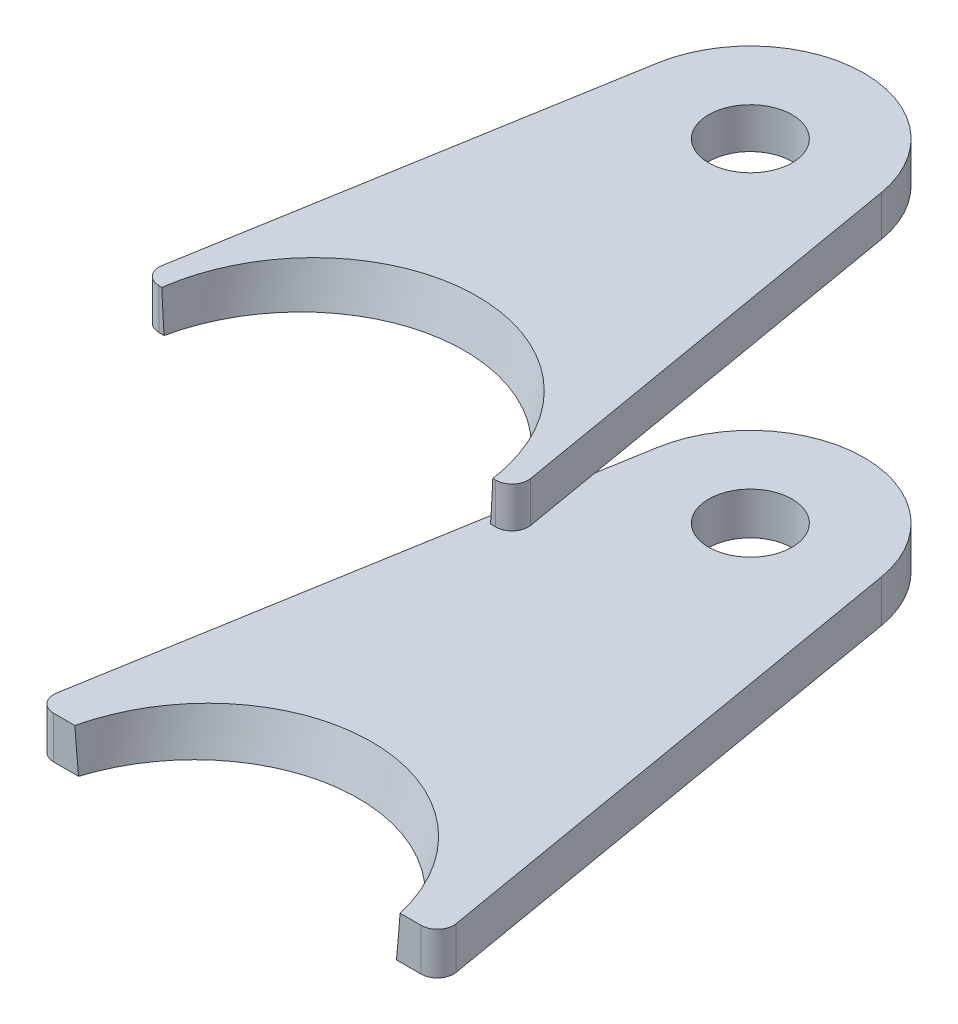
ISO-10303-21;
HEADER;
FILE_DESCRIPTION(('STEP AP214'),'2;1');
FILE_NAME('part.step','',(''),(''),'','','');
FILE_SCHEMA(('AUTOMOTIVE_DESIGN { 1 0 10303 214 1 1 1 1 }'));
ENDSEC;
DATA;
#1=APPLICATION_CONTEXT('core data for automotive mechanical design processes');
#2=APPLICATION_PROTOCOL_DEFINITION('international standard','automotive_design',2000,#1);
#3=PRODUCT_CONTEXT('',#1,'mechanical');
#4=PRODUCT('Part','Part','',(#3));
#5=PRODUCT_RELATED_PRODUCT_CATEGORY('part','',(#4));
#6=PRODUCT_DEFINITION_FORMATION('','',#4);
#7=PRODUCT_DEFINITION_CONTEXT('part definition',#1,'design');
#8=PRODUCT_DEFINITION('design','',#6,#7);
#9=PRODUCT_DEFINITION_SHAPE('','',#8);
#10=(LENGTH_UNIT() NAMED_UNIT(*) SI_UNIT(.MILLI.,.METRE.));
#11=(NAMED_UNIT(*) PLANE_ANGLE_UNIT() SI_UNIT($,.RADIAN.));
#12=(NAMED_UNIT(*) SI_UNIT($,.STERADIAN.) SOLID_ANGLE_UNIT());
#13=UNCERTAINTY_MEASURE_WITH_UNIT(LENGTH_MEASURE(1.E-05),#10,'distance_accuracy_value','');
#14=(GEOMETRIC_REPRESENTATION_CONTEXT(3) GLOBAL_UNCERTAINTY_ASSIGNED_CONTEXT((#13)) GLOBAL_UNIT_ASSIGNED_CONTEXT((#10,
#11,#12)) REPRESENTATION_CONTEXT('',''));
#15=CARTESIAN_POINT('',(0.,0.,0.));
#16=DIRECTION('',(0.,0.,1.));
#17=DIRECTION('',(1.,0.,0.));
#18=AXIS2_PLACEMENT_3D('',#15,#16,#17);
#19=CARTESIAN_POINT('',(0.,-11.43,0.));
#20=DIRECTION('',(0.,1.,0.));
#21=DIRECTION('',(0.,0.,-1.));
#22=AXIS2_PLACEMENT_3D('',#19,#20,#21);
#23=PLANE('',#22);
#24=DIRECTION('',(-1.,0.,0.));
#25=VECTOR('',#24,1.);
#26=CARTESIAN_POINT('',(0.,-11.43,40.1184711091296));
#27=LINE('',#26,#25);
#28=CARTESIAN_POINT('',(-12.7085522232766,-11.43,40.1184711091296));
#29=VERTEX_POINT('',#28);
#30=CARTESIAN_POINT('',(-14.3695490254812,-11.43,40.1184711091296));
#31=VERTEX_POINT('',#30);
#32=EDGE_CURVE('E128',#29,#31,#27,.T.);
#33=ORIENTED_EDGE('',*,*,#32,.F.);
#34=CARTESIAN_POINT('',(0.00635000098012531,-11.43,43.3453711793951));
#35=DIRECTION('',(0.,-1.,0.));
#36=DIRECTION('',(0.00174746557868569,0.,0.99999847318086));
#37=AXIS2_PLACEMENT_3D('',#34,#35,#36);
#38=ELLIPSE('',#37,13.7261621988406,13.081);
#39=CARTESIAN_POINT('',(12.7202169755613,-11.43,40.1184711091295));
#40=VERTEX_POINT('',#39);
#41=EDGE_CURVE('E135',#40,#29,#38,.F.);
#42=ORIENTED_EDGE('',*,*,#41,.F.);
#43=CARTESIAN_POINT('',(14.3695490254812,-11.43,40.1184711091295));
#44=VERTEX_POINT('',#43);
#45=EDGE_CURVE('E140',#44,#40,#27,.T.);
#46=ORIENTED_EDGE('',*,*,#45,.F.);
#47=CARTESIAN_POINT('',(14.3695490254812,-11.43,38.8484711091295));
#48=DIRECTION('',(0.,-1.,0.));
#49=DIRECTION('',(0.,0.,-1.));
#50=AXIS2_PLACEMENT_3D('',#47,#48,#49);
#51=CIRCLE('',#50,1.27);
#52=CARTESIAN_POINT('',(15.6214000011449,-11.43,38.6345338876608));
#53=VERTEX_POINT('',#52);
#54=EDGE_CURVE('E186',#53,#44,#51,.T.);
#55=ORIENTED_EDGE('',*,*,#54,.F.);
#56=DIRECTION('',(0.168454505093508,0.,0.985709429656479));
#57=VECTOR('',#56,1.);
#58=CARTESIAN_POINT('',(8.76295682964609,-11.43,-1.49756055028128));
#59=LINE('',#58,#57);
#60=CARTESIAN_POINT('',(8.76295682964609,-11.43,-1.49756055028128));
#61=VERTEX_POINT('',#60);
#62=EDGE_CURVE('E150',#61,#53,#59,.T.);
#63=ORIENTED_EDGE('',*,*,#62,.F.);
#64=CARTESIAN_POINT('',(0.,-11.43,0.));
#65=DIRECTION('',(0.,-1.,0.));
#66=DIRECTION('',(0.,0.,-1.));
#67=AXIS2_PLACEMENT_3D('',#64,#65,#66);
#68=CIRCLE('',#67,8.89);
#69=CARTESIAN_POINT('',(-8.76295682964609,-11.43,-1.49756055028128));
#70=VERTEX_POINT('',#69);
#71=EDGE_CURVE('E147',#70,#61,#68,.T.);
#72=ORIENTED_EDGE('',*,*,#71,.F.);
#73=DIRECTION('',(-0.168454505093508,0.,0.985709429656479));
#74=VECTOR('',#73,1.);
#75=CARTESIAN_POINT('',(-8.76295682964609,-11.43,-1.49756055028128));
#76=LINE('',#75,#74);
#77=CARTESIAN_POINT('',(-15.6214000011449,-11.43,38.6345338876608));
#78=VERTEX_POINT('',#77);
#79=EDGE_CURVE('E170',#70,#78,#76,.T.);
#80=ORIENTED_EDGE('',*,*,#79,.T.);
#81=CARTESIAN_POINT('',(-14.3695490254812,-11.43,38.8484711091296));
#82=DIRECTION('',(0.,-1.,0.));
#83=DIRECTION('',(0.,0.,-1.));
#84=AXIS2_PLACEMENT_3D('',#81,#82,#83);
#85=CIRCLE('',#84,1.27);
#86=EDGE_CURVE('E146',#31,#78,#85,.T.);
#87=ORIENTED_EDGE('',*,*,#86,.F.);
#88=EDGE_LOOP('',(#33,#42,#46,#55,#63,#72,#80,#87));
#89=FACE_BOUND('',#88,.T.);
#90=CARTESIAN_POINT('',(0.,-11.43,0.));
#91=DIRECTION('',(0.,-1.,0.));
#92=DIRECTION('',(0.,0.,-1.));
#93=AXIS2_PLACEMENT_3D('',#90,#91,#92);
#94=CIRCLE('',#93,3.2639);
#95=CARTESIAN_POINT('',(0.,-11.43,-3.2639));
#96=VERTEX_POINT('',#95);
#97=EDGE_CURVE('E164',#96,#96,#94,.T.);
#98=ORIENTED_EDGE('',*,*,#97,.T.);
#99=EDGE_LOOP('',(#98));
#100=FACE_BOUND('',#99,.T.);
#101=ADVANCED_FACE('F57',(#89,#100),#23,.T.);
#102=CARTESIAN_POINT('',(-14.3695490254812,-14.732,38.8484711091296));
#103=DIRECTION('',(0.,-1.,0.));
#104=DIRECTION('',(0.,0.,1.));
#105=AXIS2_PLACEMENT_3D('',#102,#103,#104);
#106=CYLINDRICAL_SURFACE('',#105,1.27);
#107=CARTESIAN_POINT('',(-14.3695490254812,-14.732,38.8484711091296));
#108=DIRECTION('',(0.,-1.,0.));
#109=DIRECTION('',(0.,0.,-1.));
#110=AXIS2_PLACEMENT_3D('',#107,#108,#109);
#111=CIRCLE('',#110,1.27);
#112=CARTESIAN_POINT('',(-15.6214000011449,-14.732,38.6345338876608));
#113=VERTEX_POINT('',#112);
#114=CARTESIAN_POINT('',(-14.3695490254812,-14.732,40.1184711091296));
#115=VERTEX_POINT('',#114);
#116=EDGE_CURVE('E184',#113,#115,#111,.F.);
#117=ORIENTED_EDGE('',*,*,#116,.T.);
#118=DIRECTION('',(0.,1.,0.));
#119=VECTOR('',#118,1.);
#120=CARTESIAN_POINT('',(-14.3695490254812,-11.43,40.1184711091296));
#121=LINE('',#120,#119);
#122=EDGE_CURVE('E177',#115,#31,#121,.T.);
#123=ORIENTED_EDGE('',*,*,#122,.T.);
#124=ORIENTED_EDGE('',*,*,#86,.T.);
#125=DIRECTION('',(0.,1.,0.));
#126=VECTOR('',#125,1.);
#127=CARTESIAN_POINT('',(-15.6214000011449,-14.732,38.6345338876608));
#128=LINE('',#127,#126);
#129=EDGE_CURVE('E189',#78,#113,#128,.F.);
#130=ORIENTED_EDGE('',*,*,#129,.T.);
#131=EDGE_LOOP('',(#117,#123,#124,#130));
#132=FACE_BOUND('',#131,.T.);
#133=ADVANCED_FACE('F188',(#132),#106,.T.);
#134=CARTESIAN_POINT('',(-8.76295682964609,-14.732,-1.49756055028128));
#135=DIRECTION('',(0.985709429656479,0.,0.168454505093508));
#136=DIRECTION('',(-0.168454505093508,0.,0.985709429656479));
#137=AXIS2_PLACEMENT_3D('',#134,#135,#136);
#138=PLANE('',#137);
#139=ORIENTED_EDGE('',*,*,#79,.F.);
#140=DIRECTION('',(0.,1.,0.));
#141=VECTOR('',#140,1.);
#142=CARTESIAN_POINT('',(-8.76295682964609,-14.732,-1.49756055028128));
#143=LINE('',#142,#141);
#144=CARTESIAN_POINT('',(-8.76295682964609,-14.732,-1.49756055028128));
#145=VERTEX_POINT('',#144);
#146=EDGE_CURVE('E131',#145,#70,#143,.T.);
#147=ORIENTED_EDGE('',*,*,#146,.F.);
#148=DIRECTION('',(-0.168454505093508,0.,0.985709429656479));
#149=VECTOR('',#148,1.);
#150=CARTESIAN_POINT('',(-8.76295682964609,-14.732,-1.49756055028128));
#151=LINE('',#150,#149);
#152=EDGE_CURVE('E156',#145,#113,#151,.T.);
#153=ORIENTED_EDGE('',*,*,#152,.T.);
#154=ORIENTED_EDGE('',*,*,#129,.F.);
#155=EDGE_LOOP('',(#139,#147,#153,#154));
#156=FACE_BOUND('',#155,.T.);
#157=ADVANCED_FACE('F208',(#156),#138,.F.);
#158=CARTESIAN_POINT('',(0.,-14.732,0.));
#159=DIRECTION('',(0.,1.,0.));
#160=DIRECTION('',(0.,0.,-1.));
#161=AXIS2_PLACEMENT_3D('',#158,#159,#160);
#162=CYLINDRICAL_SURFACE('',#161,8.89);
#163=ORIENTED_EDGE('',*,*,#146,.T.);
#164=ORIENTED_EDGE('',*,*,#71,.T.);
#165=DIRECTION('',(0.,1.,0.));
#166=VECTOR('',#165,1.);
#167=CARTESIAN_POINT('',(8.76295682964609,-14.732,-1.49756055028128));
#168=LINE('',#167,#166);
#169=CARTESIAN_POINT('',(8.76295682964609,-14.732,-1.49756055028128));
#170=VERTEX_POINT('',#169);
#171=EDGE_CURVE('E166',#170,#61,#168,.T.);
#172=ORIENTED_EDGE('',*,*,#171,.F.);
#173=CARTESIAN_POINT('',(0.,-14.732,0.));
#174=DIRECTION('',(0.,-1.,0.));
#175=DIRECTION('',(0.,0.,-1.));
#176=AXIS2_PLACEMENT_3D('',#173,#174,#175);
#177=CIRCLE('',#176,8.89);
#178=EDGE_CURVE('E168',#145,#170,#177,.T.);
#179=ORIENTED_EDGE('',*,*,#178,.F.);
#180=EDGE_LOOP('',(#163,#164,#172,#179));
#181=FACE_BOUND('',#180,.T.);
#182=ADVANCED_FACE('F204',(#181),#162,.T.);
#183=CARTESIAN_POINT('',(8.76295682964609,-14.732,-1.49756055028128));
#184=DIRECTION('',(0.985709429656479,0.,-0.168454505093508));
#185=DIRECTION('',(0.168454505093508,0.,0.985709429656479));
#186=AXIS2_PLACEMENT_3D('',#183,#184,#185);
#187=PLANE('',#186);
#188=DIRECTION('',(0.168454505093508,0.,0.985709429656479));
#189=VECTOR('',#188,1.);
#190=CARTESIAN_POINT('',(8.76295682964609,-14.732,-1.49756055028128));
#191=LINE('',#190,#189);
#192=CARTESIAN_POINT('',(15.6214000011449,-14.732,38.6345338876608));
#193=VERTEX_POINT('',#192);
#194=EDGE_CURVE('E160',#170,#193,#191,.T.);
#195=ORIENTED_EDGE('',*,*,#194,.F.);
#196=ORIENTED_EDGE('',*,*,#171,.T.);
#197=ORIENTED_EDGE('',*,*,#62,.T.);
#198=DIRECTION('',(0.,1.,0.));
#199=VECTOR('',#198,1.);
#200=CARTESIAN_POINT('',(15.6214000011449,-14.732,38.6345338876608));
#201=LINE('',#200,#199);
#202=EDGE_CURVE('E65',#193,#53,#201,.T.);
#203=ORIENTED_EDGE('',*,*,#202,.F.);
#204=EDGE_LOOP('',(#195,#196,#197,#203));
#205=FACE_BOUND('',#204,.T.);
#206=ADVANCED_FACE('F200',(#205),#187,.T.);
#207=CARTESIAN_POINT('',(14.3695490254812,-14.732,38.8484711091295));
#208=DIRECTION('',(0.,1.,0.));
#209=DIRECTION('',(0.,0.,-1.));
#210=AXIS2_PLACEMENT_3D('',#207,#208,#209);
#211=CYLINDRICAL_SURFACE('',#210,1.27);
#212=CARTESIAN_POINT('',(14.3695490254812,-14.732,38.8484711091295));
#213=DIRECTION('',(0.,-1.,0.));
#214=DIRECTION('',(0.,0.,-1.));
#215=AXIS2_PLACEMENT_3D('',#212,#213,#214);
#216=CIRCLE('',#215,1.27);
#217=CARTESIAN_POINT('',(14.3695490254812,-14.732,40.1184711091295));
#218=VERTEX_POINT('',#217);
#219=EDGE_CURVE('E71',#218,#193,#216,.F.);
#220=ORIENTED_EDGE('',*,*,#219,.T.);
#221=ORIENTED_EDGE('',*,*,#202,.T.);
#222=ORIENTED_EDGE('',*,*,#54,.T.);
#223=DIRECTION('',(0.,1.,0.));
#224=VECTOR('',#223,1.);
#225=CARTESIAN_POINT('',(14.3695490254812,-14.732,40.1184711091295));
#226=LINE('',#225,#224);
#227=EDGE_CURVE('E12',#44,#218,#226,.F.);
#228=ORIENTED_EDGE('',*,*,#227,.T.);
#229=EDGE_LOOP('',(#220,#221,#222,#228));
#230=FACE_BOUND('',#229,.T.);
#231=ADVANCED_FACE('F59',(#230),#211,.T.);
#232=CARTESIAN_POINT('',(0.,-14.732,40.1184711091296));
#233=DIRECTION('',(0.,0.,1.));
#234=DIRECTION('',(-1.,0.,0.));
#235=AXIS2_PLACEMENT_3D('',#232,#233,#234);
#236=PLANE('',#235);
#237=ORIENTED_EDGE('',*,*,#45,.T.);
#238=CARTESIAN_POINT('',(0.000711095571889094,-1.27997183153469,40.1184711091296));
#239=DIRECTION('',(0.,0.,-1.));
#240=DIRECTION('',(0.00055555555555526,-0.999999845679001,0.));
#241=AXIS2_PLACEMENT_3D('',#238,#239,#240);
#242=ELLIPSE('',#241,43.1748520033006,13.081);
#243=CARTESIAN_POINT('',(12.4373657708462,-14.732,40.1184711091295));
#244=VERTEX_POINT('',#243);
#245=EDGE_CURVE('E133',#244,#40,#242,.F.);
#246=ORIENTED_EDGE('',*,*,#245,.F.);
#247=DIRECTION('',(-1.,0.,0.));
#248=VECTOR('',#247,1.);
#249=CARTESIAN_POINT('',(0.,-14.732,40.1184711091296));
#250=LINE('',#249,#248);
#251=EDGE_CURVE('E79',#218,#244,#250,.T.);
#252=ORIENTED_EDGE('',*,*,#251,.F.);
#253=ORIENTED_EDGE('',*,*,#227,.F.);
#254=EDGE_LOOP('',(#237,#246,#252,#253));
#255=FACE_BOUND('',#254,.T.);
#256=ADVANCED_FACE('F227',(#255),#236,.T.);
#257=CARTESIAN_POINT('',(-12.4223689158002,-14.732,40.1184711091296));
#258=VERTEX_POINT('',#257);
#259=EDGE_CURVE('E129',#258,#115,#250,.T.);
#260=ORIENTED_EDGE('',*,*,#259,.F.);
#261=EDGE_CURVE('E123',#29,#258,#242,.F.);
#262=ORIENTED_EDGE('',*,*,#261,.F.);
#263=ORIENTED_EDGE('',*,*,#32,.T.);
#264=ORIENTED_EDGE('',*,*,#122,.F.);
#265=EDGE_LOOP('',(#260,#262,#263,#264));
#266=FACE_BOUND('',#265,.T.);
#267=ADVANCED_FACE('F125',(#266),#236,.T.);
#268=CARTESIAN_POINT('',(0.,-14.732,0.));
#269=DIRECTION('',(0.,1.,0.));
#270=DIRECTION('',(0.,0.,-1.));
#271=AXIS2_PLACEMENT_3D('',#268,#269,#270);
#272=PLANE('',#271);
#273=ORIENTED_EDGE('',*,*,#152,.F.);
#274=ORIENTED_EDGE('',*,*,#178,.T.);
#275=ORIENTED_EDGE('',*,*,#194,.T.);
#276=ORIENTED_EDGE('',*,*,#219,.F.);
#277=ORIENTED_EDGE('',*,*,#251,.T.);
#278=CARTESIAN_POINT('',(0.00818444570766258,-14.732,44.3951440327475));
#279=DIRECTION('',(0.,-1.,0.));
#280=DIRECTION('',(0.00174746557868569,0.,0.99999847318086));
#281=AXIS2_PLACEMENT_3D('',#278,#279,#280);
#282=ELLIPSE('',#281,13.7261621988406,13.081);
#283=EDGE_CURVE('E176',#244,#258,#282,.F.);
#284=ORIENTED_EDGE('',*,*,#283,.T.);
#285=ORIENTED_EDGE('',*,*,#259,.T.);
#286=ORIENTED_EDGE('',*,*,#116,.F.);
#287=EDGE_LOOP('',(#273,#274,#275,#276,#277,#284,#285,#286));
#288=FACE_BOUND('',#287,.T.);
#289=CARTESIAN_POINT('',(0.,-14.732,0.));
#290=DIRECTION('',(0.,-1.,0.));
#291=DIRECTION('',(0.,0.,-1.));
#292=AXIS2_PLACEMENT_3D('',#289,#290,#291);
#293=CIRCLE('',#292,3.2639);
#294=CARTESIAN_POINT('',(0.,-14.732,-3.2639));
#295=VERTEX_POINT('',#294);
#296=EDGE_CURVE('E154',#295,#295,#293,.T.);
#297=ORIENTED_EDGE('',*,*,#296,.F.);
#298=EDGE_LOOP('',(#297));
#299=FACE_BOUND('',#298,.T.);
#300=ADVANCED_FACE('F181',(#288,#299),#272,.F.);
#301=CARTESIAN_POINT('',(0.,-14.732,0.));
#302=DIRECTION('',(0.,1.,0.));
#303=DIRECTION('',(0.,0.,-1.));
#304=AXIS2_PLACEMENT_3D('',#301,#302,#303);
#305=CYLINDRICAL_SURFACE('',#304,3.2639);
#306=CARTESIAN_POINT('',(0.,-14.732,-3.2639));
#307=CARTESIAN_POINT('',(0.,-14.6976041666667,-3.2639));
#308=CARTESIAN_POINT('',(0.,-14.6632083333333,-3.2639));
#309=CARTESIAN_POINT('',(0.,-14.5944166666667,-3.2639));
#310=CARTESIAN_POINT('',(0.,-14.5600208333333,-3.2639));
#311=CARTESIAN_POINT('',(0.,-14.4912291666667,-3.2639));
#312=CARTESIAN_POINT('',(0.,-14.4568333333333,-3.2639));
#313=CARTESIAN_POINT('',(0.,-14.3880416666667,-3.2639));
#314=CARTESIAN_POINT('',(0.,-14.3536458333333,-3.2639));
#315=CARTESIAN_POINT('',(0.,-14.2848541666667,-3.2639));
#316=CARTESIAN_POINT('',(0.,-14.2504583333333,-3.2639));
#317=CARTESIAN_POINT('',(0.,-14.1816666666667,-3.2639));
#318=CARTESIAN_POINT('',(0.,-14.1472708333333,-3.2639));
#319=CARTESIAN_POINT('',(0.,-14.0784791666667,-3.2639));
#320=CARTESIAN_POINT('',(0.,-14.0440833333333,-3.2639));
#321=CARTESIAN_POINT('',(0.,-13.9752916666667,-3.2639));
#322=CARTESIAN_POINT('',(0.,-13.9408958333333,-3.2639));
#323=CARTESIAN_POINT('',(0.,-13.8721041666667,-3.2639));
#324=CARTESIAN_POINT('',(0.,-13.8377083333333,-3.2639));
#325=CARTESIAN_POINT('',(0.,-13.7689166666667,-3.2639));
#326=CARTESIAN_POINT('',(0.,-13.7345208333333,-3.2639));
#327=CARTESIAN_POINT('',(0.,-13.6657291666667,-3.2639));
#328=CARTESIAN_POINT('',(0.,-13.6313333333333,-3.2639));
#329=CARTESIAN_POINT('',(0.,-13.5625416666667,-3.2639));
#330=CARTESIAN_POINT('',(0.,-13.5281458333333,-3.2639));
#331=CARTESIAN_POINT('',(0.,-13.4593541666667,-3.2639));
#332=CARTESIAN_POINT('',(0.,-13.4249583333333,-3.2639));
#333=CARTESIAN_POINT('',(0.,-13.3561666666667,-3.2639));
#334=CARTESIAN_POINT('',(0.,-13.3217708333333,-3.2639));
#335=CARTESIAN_POINT('',(0.,-13.2529791666667,-3.2639));
#336=CARTESIAN_POINT('',(0.,-13.2185833333333,-3.2639));
#337=CARTESIAN_POINT('',(0.,-13.1497916666667,-3.2639));
#338=CARTESIAN_POINT('',(0.,-13.1153958333333,-3.2639));
#339=CARTESIAN_POINT('',(0.,-13.0466041666667,-3.2639));
#340=CARTESIAN_POINT('',(0.,-13.0122083333333,-3.2639));
#341=CARTESIAN_POINT('',(0.,-12.9434166666667,-3.2639));
#342=CARTESIAN_POINT('',(0.,-12.9090208333333,-3.2639));
#343=CARTESIAN_POINT('',(0.,-12.8402291666667,-3.2639));
#344=CARTESIAN_POINT('',(0.,-12.8058333333333,-3.2639));
#345=CARTESIAN_POINT('',(0.,-12.7370416666667,-3.2639));
#346=CARTESIAN_POINT('',(0.,-12.7026458333333,-3.2639));
#347=CARTESIAN_POINT('',(0.,-12.6338541666667,-3.2639));
#348=CARTESIAN_POINT('',(0.,-12.5994583333333,-3.2639));
#349=CARTESIAN_POINT('',(0.,-12.5306666666667,-3.2639));
#350=CARTESIAN_POINT('',(0.,-12.4962708333333,-3.2639));
#351=CARTESIAN_POINT('',(0.,-12.4274791666667,-3.2639));
#352=CARTESIAN_POINT('',(0.,-12.3930833333333,-3.2639));
#353=CARTESIAN_POINT('',(0.,-12.3242916666667,-3.2639));
#354=CARTESIAN_POINT('',(0.,-12.2898958333333,-3.2639));
#355=CARTESIAN_POINT('',(0.,-12.2211041666667,-3.2639));
#356=CARTESIAN_POINT('',(0.,-12.1867083333333,-3.2639));
#357=CARTESIAN_POINT('',(0.,-12.1179166666667,-3.2639));
#358=CARTESIAN_POINT('',(0.,-12.0835208333333,-3.2639));
#359=CARTESIAN_POINT('',(0.,-12.0147291666667,-3.2639));
#360=CARTESIAN_POINT('',(0.,-11.9803333333333,-3.2639));
#361=CARTESIAN_POINT('',(0.,-11.9115416666667,-3.2639));
#362=CARTESIAN_POINT('',(0.,-11.8771458333333,-3.2639));
#363=CARTESIAN_POINT('',(0.,-11.8083541666667,-3.2639));
#364=CARTESIAN_POINT('',(0.,-11.7739583333333,-3.2639));
#365=CARTESIAN_POINT('',(0.,-11.7051666666667,-3.2639));
#366=CARTESIAN_POINT('',(0.,-11.6707708333333,-3.2639));
#367=CARTESIAN_POINT('',(0.,-11.6019791666667,-3.2639));
#368=CARTESIAN_POINT('',(0.,-11.5675833333333,-3.2639));
#369=CARTESIAN_POINT('',(0.,-11.4987916666667,-3.2639));
#370=CARTESIAN_POINT('',(0.,-11.4643958333333,-3.2639));
#371=CARTESIAN_POINT('',(0.,-11.43,-3.2639));
#372=B_SPLINE_CURVE_WITH_KNOTS('',3,(#306,#307,#308,#309,#310,#311,#312,#313,#314,#315,#316,
#317,#318,#319,#320,#321,#322,#323,#324,#325,#326,#327,#328,#329,#330,#331,#332,#333,#334,#335,
#336,#337,#338,#339,#340,#341,#342,#343,#344,#345,#346,#347,#348,#349,#350,#351,#352,#353,#354,
#355,#356,#357,#358,#359,#360,#361,#362,#363,#364,#365,#366,#367,#368,#369,#370,#371),
.UNSPECIFIED.,.F.,.F.,(4,2,2,2,2,2,2,2,2,2,2,2,2,2,2,2,2,2,2,2,2,2,2,2,2,2,2,2,2,2,2,2,4),(0.,
0.103187499999999,0.206375,0.309562499999999,0.41275,0.515937499999999,0.619125,
0.722312499999999,0.8255,0.928687499999999,1.031875,1.1350625,1.23825,1.3414375,1.444625,
1.5478125,1.651,1.7541875,1.857375,1.9605625,2.06375,2.1669375,2.270125,2.3733125,2.4765,
2.5796875,2.682875,2.7860625,2.88925,2.9924375,3.095625,3.1988125,3.302),.UNSPECIFIED.);
#373=EDGE_CURVE('BSEAM225',#295,#96,#372,.T.);
#374=ORIENTED_EDGE('',*,*,#296,.T.);
#375=ORIENTED_EDGE('',*,*,#97,.F.);
#376=ORIENTED_EDGE('',*,*,#373,.T.);
#377=ORIENTED_EDGE('',*,*,#373,.F.);
#378=EDGE_LOOP('',(#374,#376,#375,#377));
#379=FACE_BOUND('',#378,.T.);
#380=ADVANCED_FACE('F225',(#379),#305,.F.);
#381=CARTESIAN_POINT('',(-0.0609017951073154,109.623214276372,4.86009614657135));
#382=DIRECTION('',(0.000529443207681107,-0.952997626758693,0.302977297965028));
#383=DIRECTION('',(-0.000168320721091388,0.302977251209269,0.952997773826262));
#384=AXIS2_PLACEMENT_3D('',#381,#382,#383);
#385=CYLINDRICAL_SURFACE('',#384,13.081);
#386=ORIENTED_EDGE('',*,*,#283,.F.);
#387=ORIENTED_EDGE('',*,*,#245,.T.);
#388=ORIENTED_EDGE('',*,*,#41,.T.);
#389=ORIENTED_EDGE('',*,*,#261,.T.);
#390=EDGE_LOOP('',(#386,#387,#388,#389));
#391=FACE_BOUND('',#390,.T.);
#392=ADVANCED_FACE('F136',(#391),#385,.F.);
#393=CLOSED_SHELL('',(#101,#133,#157,#182,#206,#231,#256,#267,#300,#380,#392));
#394=MANIFOLD_SOLID_BREP('B2',#393);
#395=CARTESIAN_POINT('',(-8.76295682964609,14.605,-1.49756055028128));
#396=DIRECTION('',(-0.985709429656479,0.,-0.168454505093508));
#397=DIRECTION('',(0.168454505093508,0.,-0.985709429656479));
#398=AXIS2_PLACEMENT_3D('',#395,#396,#397);
#399=PLANE('',#398);
#400=DIRECTION('',(-0.168454505093508,0.,0.985709429656479));
#401=VECTOR('',#400,1.);
#402=CARTESIAN_POINT('',(-8.76295682964609,14.605,-1.49756055028128));
#403=LINE('',#402,#401);
#404=CARTESIAN_POINT('',(-8.7629568296461,14.605,-1.49756055028128));
#405=VERTEX_POINT('',#404);
#406=CARTESIAN_POINT('',(-14.418582270087,14.605,31.5962609782862));
#407=VERTEX_POINT('',#406);
#408=EDGE_CURVE('E406',#405,#407,#403,.T.);
#409=ORIENTED_EDGE('',*,*,#408,.F.);
#410=DIRECTION('',(0.,-1.,0.));
#411=VECTOR('',#410,1.);
#412=CARTESIAN_POINT('',(-8.7629568296461,14.605,-1.49756055028128));
#413=LINE('',#412,#411);
#414=CARTESIAN_POINT('',(-8.7629568296461,11.43,-1.49756055028128));
#415=VERTEX_POINT('',#414);
#416=EDGE_CURVE('E420',#405,#415,#413,.T.);
#417=ORIENTED_EDGE('',*,*,#416,.T.);
#418=DIRECTION('',(-0.168454505093508,0.,0.985709429656479));
#419=VECTOR('',#418,1.);
#420=CARTESIAN_POINT('',(-8.76295682964609,11.43,-1.49756055028128));
#421=LINE('',#420,#419);
#422=CARTESIAN_POINT('',(-14.418582270087,11.43,31.5962609782862));
#423=VERTEX_POINT('',#422);
#424=EDGE_CURVE('E415',#415,#423,#421,.T.);
#425=ORIENTED_EDGE('',*,*,#424,.T.);
#426=DIRECTION('',(0.,1.,0.));
#427=VECTOR('',#426,1.);
#428=CARTESIAN_POINT('',(-14.418582270087,14.605,31.5962609782862));
#429=LINE('',#428,#427);
#430=EDGE_CURVE('E55',#407,#423,#429,.F.);
#431=ORIENTED_EDGE('',*,*,#430,.F.);
#432=EDGE_LOOP('',(#409,#417,#425,#431));
#433=FACE_BOUND('',#432,.T.);
#434=ADVANCED_FACE('F326',(#433),#399,.T.);
#435=CARTESIAN_POINT('',(8.76295682964609,14.605,-1.49756055028128));
#436=DIRECTION('',(-0.985709429656479,0.,0.168454505093508));
#437=DIRECTION('',(-0.168454505093508,0.,-0.985709429656479));
#438=AXIS2_PLACEMENT_3D('',#435,#436,#437);
#439=PLANE('',#438);
#440=DIRECTION('',(0.168454505093508,0.,0.985709429656479));
#441=VECTOR('',#440,1.);
#442=CARTESIAN_POINT('',(8.76295682964609,11.43,-1.49756055028128));
#443=LINE('',#442,#441);
#444=CARTESIAN_POINT('',(8.7629568296461,11.43,-1.49756055028128));
#445=VERTEX_POINT('',#444);
#446=CARTESIAN_POINT('',(14.418582270087,11.43,31.5962609782862));
#447=VERTEX_POINT('',#446);
#448=EDGE_CURVE('E423',#445,#447,#443,.T.);
#449=ORIENTED_EDGE('',*,*,#448,.F.);
#450=DIRECTION('',(0.,-1.,0.));
#451=VECTOR('',#450,1.);
#452=CARTESIAN_POINT('',(8.7629568296461,14.605,-1.49756055028128));
#453=LINE('',#452,#451);
#454=CARTESIAN_POINT('',(8.7629568296461,14.605,-1.49756055028128));
#455=VERTEX_POINT('',#454);
#456=EDGE_CURVE('E425',#455,#445,#453,.T.);
#457=ORIENTED_EDGE('',*,*,#456,.F.);
#458=DIRECTION('',(0.168454505093508,0.,0.985709429656479));
#459=VECTOR('',#458,1.);
#460=CARTESIAN_POINT('',(8.76295682964609,14.605,-1.49756055028128));
#461=LINE('',#460,#459);
#462=CARTESIAN_POINT('',(14.418582270087,14.605,31.5962609782862));
#463=VERTEX_POINT('',#462);
#464=EDGE_CURVE('E434',#455,#463,#461,.T.);
#465=ORIENTED_EDGE('',*,*,#464,.T.);
#466=DIRECTION('',(0.,1.,0.));
#467=VECTOR('',#466,1.);
#468=CARTESIAN_POINT('',(14.418582270087,14.605,31.5962609782862));
#469=LINE('',#468,#467);
#470=EDGE_CURVE('E401',#447,#463,#469,.T.);
#471=ORIENTED_EDGE('',*,*,#470,.F.);
#472=EDGE_LOOP('',(#449,#457,#465,#471));
#473=FACE_BOUND('',#472,.T.);
#474=ADVANCED_FACE('F470',(#473),#439,.F.);
#475=CARTESIAN_POINT('',(0.,11.43,0.));
#476=DIRECTION('',(0.,1.,0.));
#477=DIRECTION('',(0.,0.,-1.));
#478=AXIS2_PLACEMENT_3D('',#475,#476,#477);
#479=PLANE('',#478);
#480=CARTESIAN_POINT('',(0.,11.43,0.));
#481=DIRECTION('',(0.,-1.,0.));
#482=DIRECTION('',(0.,0.,-1.));
#483=AXIS2_PLACEMENT_3D('',#480,#481,#482);
#484=CIRCLE('',#483,3.2639);
#485=CARTESIAN_POINT('',(0.,11.43,-3.2639));
#486=VERTEX_POINT('',#485);
#487=EDGE_CURVE('E412',#486,#486,#484,.T.);
#488=ORIENTED_EDGE('',*,*,#487,.F.);
#489=EDGE_LOOP('',(#488));
#490=FACE_BOUND('',#489,.T.);
#491=DIRECTION('',(1.,0.,0.));
#492=VECTOR('',#491,1.);
#493=CARTESIAN_POINT('',(0.,11.43,33.080198199755));
#494=LINE('',#493,#492);
#495=CARTESIAN_POINT('',(12.7584463349454,11.43,33.080198199755));
#496=VERTEX_POINT('',#495);
#497=CARTESIAN_POINT('',(13.1667312944233,11.43,33.080198199755));
#498=VERTEX_POINT('',#497);
#499=EDGE_CURVE('E407',#496,#498,#494,.T.);
#500=ORIENTED_EDGE('',*,*,#499,.F.);
#501=CARTESIAN_POINT('',(-0.0063500009797481,11.43,36.0777129638786));
#502=DIRECTION('',(0.,-1.,0.));
#503=DIRECTION('',(0.00174746557868569,0.,0.99999847318086));
#504=AXIS2_PLACEMENT_3D('',#501,#502,#503);
#505=ELLIPSE('',#504,13.7261621988406,13.081);
#506=CARTESIAN_POINT('',(-12.7721079954996,11.43,33.080198199755));
#507=VERTEX_POINT('',#506);
#508=EDGE_CURVE('E397',#496,#507,#505,.F.);
#509=ORIENTED_EDGE('',*,*,#508,.T.);
#510=CARTESIAN_POINT('',(-13.1667312944233,11.43,33.080198199755));
#511=VERTEX_POINT('',#510);
#512=EDGE_CURVE('E404',#511,#507,#494,.T.);
#513=ORIENTED_EDGE('',*,*,#512,.F.);
#514=CARTESIAN_POINT('',(-13.1667312944233,11.43,31.810198199755));
#515=DIRECTION('',(0.,-1.,0.));
#516=DIRECTION('',(0.,0.,-1.));
#517=AXIS2_PLACEMENT_3D('',#514,#515,#516);
#518=CIRCLE('',#517,1.27);
#519=EDGE_CURVE('E347',#423,#511,#518,.F.);
#520=ORIENTED_EDGE('',*,*,#519,.F.);
#521=ORIENTED_EDGE('',*,*,#424,.F.);
#522=CARTESIAN_POINT('',(0.,11.43,0.));
#523=DIRECTION('',(0.,-1.,0.));
#524=DIRECTION('',(0.,0.,-1.));
#525=AXIS2_PLACEMENT_3D('',#522,#523,#524);
#526=CIRCLE('',#525,8.89);
#527=EDGE_CURVE('E424',#415,#445,#526,.T.);
#528=ORIENTED_EDGE('',*,*,#527,.T.);
#529=ORIENTED_EDGE('',*,*,#448,.T.);
#530=CARTESIAN_POINT('',(13.1667312944233,11.43,31.810198199755));
#531=DIRECTION('',(0.,-1.,0.));
#532=DIRECTION('',(0.,0.,-1.));
#533=AXIS2_PLACEMENT_3D('',#530,#531,#532);
#534=CIRCLE('',#533,1.27);
#535=EDGE_CURVE('E453',#498,#447,#534,.F.);
#536=ORIENTED_EDGE('',*,*,#535,.F.);
#537=EDGE_LOOP('',(#500,#509,#513,#520,#521,#528,#529,#536));
#538=FACE_BOUND('',#537,.T.);
#539=ADVANCED_FACE('F409',(#490,#538),#479,.F.);
#540=CARTESIAN_POINT('',(-0.0609017951073154,109.623214276372,4.86009614657135));
#541=DIRECTION('',(0.000529443207681107,-0.952997626758693,0.302977297965028));
#542=DIRECTION('',(-0.000168320721091388,0.302977251209269,0.952997773826262));
#543=AXIS2_PLACEMENT_3D('',#540,#541,#542);
#544=CYLINDRICAL_SURFACE('',#543,13.081);
#545=ORIENTED_EDGE('',*,*,#508,.F.);
#546=CARTESIAN_POINT('',(-0.0115880628492294,20.8585099100517,33.080198199755));
#547=DIRECTION('',(0.,0.,-1.));
#548=DIRECTION('',(0.000555555555555474,-0.999999845679001,0.));
#549=AXIS2_PLACEMENT_3D('',#546,#547,#548);
#550=ELLIPSE('',#549,43.1748520033006,13.081);
#551=CARTESIAN_POINT('',(12.9346281460759,14.605,33.080198199755));
#552=VERTEX_POINT('',#551);
#553=EDGE_CURVE('E402',#552,#496,#550,.T.);
#554=ORIENTED_EDGE('',*,*,#553,.F.);
#555=CARTESIAN_POINT('',(-0.00811389014084163,14.605,35.0683159895013));
#556=DIRECTION('',(0.,-1.,0.));
#557=DIRECTION('',(0.00174746557868569,0.,0.99999847318086));
#558=AXIS2_PLACEMENT_3D('',#555,#556,#557);
#559=ELLIPSE('',#558,13.7261621988406,13.081);
#560=CARTESIAN_POINT('',(-12.951493751593,14.605,33.080198199755));
#561=VERTEX_POINT('',#560);
#562=EDGE_CURVE('E400',#552,#561,#559,.F.);
#563=ORIENTED_EDGE('',*,*,#562,.T.);
#564=EDGE_CURVE('E393',#507,#561,#550,.T.);
#565=ORIENTED_EDGE('',*,*,#564,.F.);
#566=EDGE_LOOP('',(#545,#554,#563,#565));
#567=FACE_BOUND('',#566,.T.);
#568=ADVANCED_FACE('F394',(#567),#544,.F.);
#569=CARTESIAN_POINT('',(0.,14.605,0.));
#570=DIRECTION('',(0.,-1.,0.));
#571=DIRECTION('',(0.,0.,1.));
#572=AXIS2_PLACEMENT_3D('',#569,#570,#571);
#573=CYLINDRICAL_SURFACE('',#572,8.89);
#574=ORIENTED_EDGE('',*,*,#527,.F.);
#575=ORIENTED_EDGE('',*,*,#416,.F.);
#576=CARTESIAN_POINT('',(0.,14.605,0.));
#577=DIRECTION('',(0.,-1.,0.));
#578=DIRECTION('',(0.,0.,-1.));
#579=AXIS2_PLACEMENT_3D('',#576,#577,#578);
#580=CIRCLE('',#579,8.89);
#581=EDGE_CURVE('E439',#405,#455,#580,.T.);
#582=ORIENTED_EDGE('',*,*,#581,.T.);
#583=ORIENTED_EDGE('',*,*,#456,.T.);
#584=EDGE_LOOP('',(#574,#575,#582,#583));
#585=FACE_BOUND('',#584,.T.);
#586=ADVANCED_FACE('F472',(#585),#573,.T.);
#587=CARTESIAN_POINT('',(0.,14.605,0.));
#588=DIRECTION('',(0.,-1.,0.));
#589=DIRECTION('',(0.,0.,1.));
#590=AXIS2_PLACEMENT_3D('',#587,#588,#589);
#591=CYLINDRICAL_SURFACE('',#590,3.2639);
#592=CARTESIAN_POINT('',(0.,14.605,0.));
#593=DIRECTION('',(0.,-1.,0.));
#594=DIRECTION('',(0.,0.,-1.));
#595=AXIS2_PLACEMENT_3D('',#592,#593,#594);
#596=CIRCLE('',#595,3.2639);
#597=CARTESIAN_POINT('',(0.,14.605,-3.2639));
#598=VERTEX_POINT('',#597);
#599=EDGE_CURVE('E427',#598,#598,#596,.T.);
#600=ORIENTED_EDGE('',*,*,#599,.F.);
#601=EDGE_LOOP('',(#600));
#602=FACE_BOUND('',#601,.T.);
#603=ORIENTED_EDGE('',*,*,#487,.T.);
#604=EDGE_LOOP('',(#603));
#605=FACE_BOUND('',#604,.T.);
#606=ADVANCED_FACE('F485',(#602,#605),#591,.F.);
#607=CARTESIAN_POINT('',(0.,-21.0907593015114,33.080198199755));
#608=DIRECTION('',(0.,0.,1.));
#609=DIRECTION('',(-1.,0.,0.));
#610=AXIS2_PLACEMENT_3D('',#607,#608,#609);
#611=PLANE('',#610);
#612=DIRECTION('',(-1.,0.,0.));
#613=VECTOR('',#612,1.);
#614=CARTESIAN_POINT('',(0.,14.605,33.080198199755));
#615=LINE('',#614,#613);
#616=CARTESIAN_POINT('',(13.1667312944233,14.605,33.080198199755));
#617=VERTEX_POINT('',#616);
#618=EDGE_CURVE('E419',#617,#552,#615,.T.);
#619=ORIENTED_EDGE('',*,*,#618,.T.);
#620=ORIENTED_EDGE('',*,*,#553,.T.);
#621=ORIENTED_EDGE('',*,*,#499,.T.);
#622=DIRECTION('',(0.,1.,0.));
#623=VECTOR('',#622,1.);
#624=CARTESIAN_POINT('',(13.1667312944233,11.43,33.080198199755));
#625=LINE('',#624,#623);
#626=EDGE_CURVE('E450',#617,#498,#625,.F.);
#627=ORIENTED_EDGE('',*,*,#626,.F.);
#628=EDGE_LOOP('',(#619,#620,#621,#627));
#629=FACE_BOUND('',#628,.T.);
#630=ADVANCED_FACE('F461',(#629),#611,.T.);
#631=ORIENTED_EDGE('',*,*,#512,.T.);
#632=ORIENTED_EDGE('',*,*,#564,.T.);
#633=CARTESIAN_POINT('',(-13.1667312944233,14.605,33.080198199755));
#634=VERTEX_POINT('',#633);
#635=EDGE_CURVE('E456',#561,#634,#615,.T.);
#636=ORIENTED_EDGE('',*,*,#635,.T.);
#637=DIRECTION('',(0.,1.,0.));
#638=VECTOR('',#637,1.);
#639=CARTESIAN_POINT('',(-13.1667312944233,-21.0907593015114,33.080198199755));
#640=LINE('',#639,#638);
#641=EDGE_CURVE('E334',#511,#634,#640,.T.);
#642=ORIENTED_EDGE('',*,*,#641,.F.);
#643=EDGE_LOOP('',(#631,#632,#636,#642));
#644=FACE_BOUND('',#643,.T.);
#645=ADVANCED_FACE('F405',(#644),#611,.T.);
#646=CARTESIAN_POINT('',(13.1667312944233,14.605,31.810198199755));
#647=DIRECTION('',(0.,-1.,0.));
#648=DIRECTION('',(0.,0.,1.));
#649=AXIS2_PLACEMENT_3D('',#646,#647,#648);
#650=CYLINDRICAL_SURFACE('',#649,1.27);
#651=ORIENTED_EDGE('',*,*,#535,.T.);
#652=ORIENTED_EDGE('',*,*,#470,.T.);
#653=CARTESIAN_POINT('',(13.1667312944233,14.605,31.810198199755));
#654=DIRECTION('',(0.,-1.,0.));
#655=DIRECTION('',(0.,0.,-1.));
#656=AXIS2_PLACEMENT_3D('',#653,#654,#655);
#657=CIRCLE('',#656,1.27);
#658=EDGE_CURVE('E448',#463,#617,#657,.T.);
#659=ORIENTED_EDGE('',*,*,#658,.T.);
#660=ORIENTED_EDGE('',*,*,#626,.T.);
#661=EDGE_LOOP('',(#651,#652,#659,#660));
#662=FACE_BOUND('',#661,.T.);
#663=ADVANCED_FACE('F467',(#662),#650,.T.);
#664=CARTESIAN_POINT('',(-13.1667312944233,-21.0907593015114,31.810198199755));
#665=DIRECTION('',(0.,1.,0.));
#666=DIRECTION('',(0.,0.,-1.));
#667=AXIS2_PLACEMENT_3D('',#664,#665,#666);
#668=CYLINDRICAL_SURFACE('',#667,1.27);
#669=ORIENTED_EDGE('',*,*,#519,.T.);
#670=ORIENTED_EDGE('',*,*,#641,.T.);
#671=CARTESIAN_POINT('',(-13.1667312944233,14.605,31.810198199755));
#672=DIRECTION('',(0.,-1.,0.));
#673=DIRECTION('',(0.,0.,-1.));
#674=AXIS2_PLACEMENT_3D('',#671,#672,#673);
#675=CIRCLE('',#674,1.27);
#676=EDGE_CURVE('E446',#634,#407,#675,.T.);
#677=ORIENTED_EDGE('',*,*,#676,.T.);
#678=ORIENTED_EDGE('',*,*,#430,.T.);
#679=EDGE_LOOP('',(#669,#670,#677,#678));
#680=FACE_BOUND('',#679,.T.);
#681=ADVANCED_FACE('F328',(#680),#668,.T.);
#682=CARTESIAN_POINT('',(0.,14.605,0.));
#683=DIRECTION('',(0.,1.,0.));
#684=DIRECTION('',(0.,0.,-1.));
#685=AXIS2_PLACEMENT_3D('',#682,#683,#684);
#686=PLANE('',#685);
#687=ORIENTED_EDGE('',*,*,#599,.T.);
#688=EDGE_LOOP('',(#687));
#689=FACE_BOUND('',#688,.T.);
#690=ORIENTED_EDGE('',*,*,#464,.F.);
#691=ORIENTED_EDGE('',*,*,#581,.F.);
#692=ORIENTED_EDGE('',*,*,#408,.T.);
#693=ORIENTED_EDGE('',*,*,#676,.F.);
#694=ORIENTED_EDGE('',*,*,#635,.F.);
#695=ORIENTED_EDGE('',*,*,#562,.F.);
#696=ORIENTED_EDGE('',*,*,#618,.F.);
#697=ORIENTED_EDGE('',*,*,#658,.F.);
#698=EDGE_LOOP('',(#690,#691,#692,#693,#694,#695,#696,#697));
#699=FACE_BOUND('',#698,.T.);
#700=ADVANCED_FACE('F464',(#689,#699),#686,.T.);
#701=CLOSED_SHELL('',(#434,#474,#539,#568,#586,#606,#630,#645,#663,#681,#700));
#702=MANIFOLD_SOLID_BREP('B6',#701);
#703=ADVANCED_BREP_SHAPE_REPRESENTATION('',(#18,#394,#702),#14);
#704=SHAPE_DEFINITION_REPRESENTATION(#9,#703);
ENDSEC;
END-ISO-10303-21;
